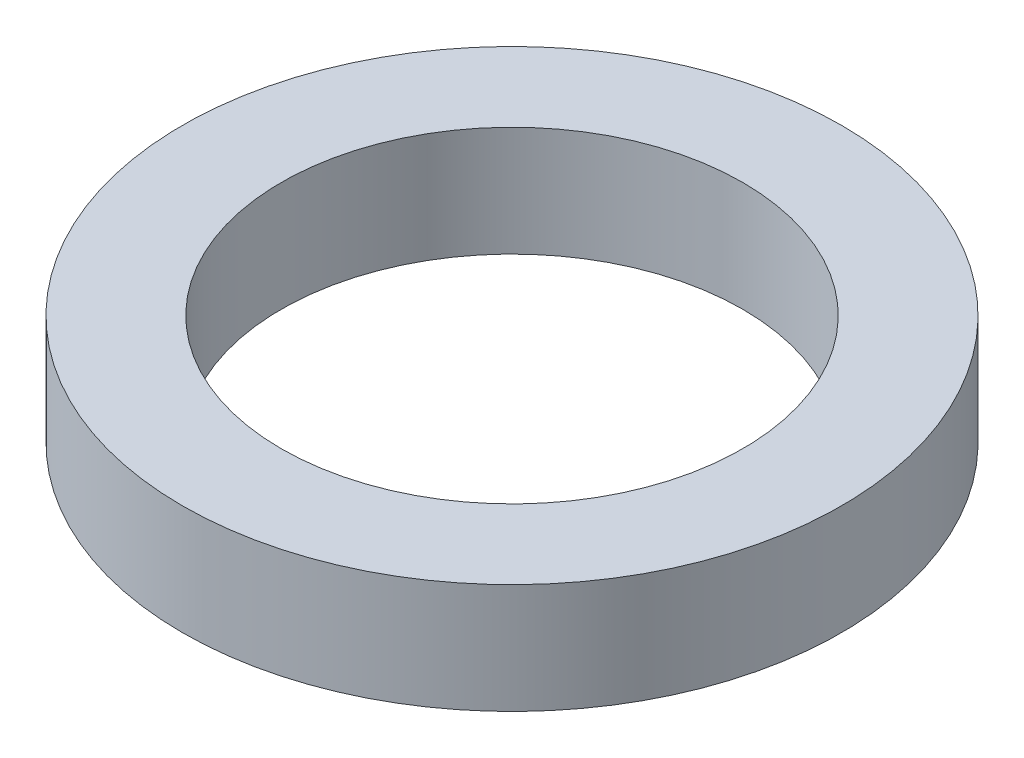
ISO-10303-21;
HEADER;
FILE_DESCRIPTION(('STEP AP214'),'2;1');
FILE_NAME('part.step','',(''),(''),'','','');
FILE_SCHEMA(('AUTOMOTIVE_DESIGN { 1 0 10303 214 1 1 1 1 }'));
ENDSEC;
DATA;
#1=APPLICATION_CONTEXT('core data for automotive mechanical design processes');
#2=APPLICATION_PROTOCOL_DEFINITION('international standard','automotive_design',2000,#1);
#3=PRODUCT_CONTEXT('',#1,'mechanical');
#4=PRODUCT('Part','Part','',(#3));
#5=PRODUCT_RELATED_PRODUCT_CATEGORY('part','',(#4));
#6=PRODUCT_DEFINITION_FORMATION('','',#4);
#7=PRODUCT_DEFINITION_CONTEXT('part definition',#1,'design');
#8=PRODUCT_DEFINITION('design','',#6,#7);
#9=PRODUCT_DEFINITION_SHAPE('','',#8);
#10=(LENGTH_UNIT() NAMED_UNIT(*) SI_UNIT(.MILLI.,.METRE.));
#11=(NAMED_UNIT(*) PLANE_ANGLE_UNIT() SI_UNIT($,.RADIAN.));
#12=(NAMED_UNIT(*) SI_UNIT($,.STERADIAN.) SOLID_ANGLE_UNIT());
#13=UNCERTAINTY_MEASURE_WITH_UNIT(LENGTH_MEASURE(1.E-05),#10,'distance_accuracy_value','');
#14=(GEOMETRIC_REPRESENTATION_CONTEXT(3) GLOBAL_UNCERTAINTY_ASSIGNED_CONTEXT((#13)) GLOBAL_UNIT_ASSIGNED_CONTEXT((#10,
#11,#12)) REPRESENTATION_CONTEXT('',''));
#15=CARTESIAN_POINT('',(0.,0.,0.));
#16=DIRECTION('',(0.,0.,1.));
#17=DIRECTION('',(1.,0.,0.));
#18=AXIS2_PLACEMENT_3D('',#15,#16,#17);
#19=CARTESIAN_POINT('',(0.,1.,0.));
#20=DIRECTION('',(0.,1.,0.));
#21=DIRECTION('',(0.,0.,1.));
#22=AXIS2_PLACEMENT_3D('',#19,#20,#21);
#23=PLANE('',#22);
#24=CARTESIAN_POINT('',(0.,1.,0.));
#25=DIRECTION('',(0.,1.,0.));
#26=DIRECTION('',(0.,0.,1.));
#27=AXIS2_PLACEMENT_3D('',#24,#25,#26);
#28=CIRCLE('',#27,3.);
#29=CARTESIAN_POINT('',(0.,1.,3.));
#30=VERTEX_POINT('',#29);
#31=EDGE_CURVE('E10',#30,#30,#28,.T.);
#32=ORIENTED_EDGE('',*,*,#31,.T.);
#33=EDGE_LOOP('',(#32));
#34=FACE_BOUND('',#33,.T.);
#35=CARTESIAN_POINT('',(0.,1.,0.));
#36=DIRECTION('',(0.,1.,0.));
#37=DIRECTION('',(0.,0.,1.));
#38=AXIS2_PLACEMENT_3D('',#35,#36,#37);
#39=CIRCLE('',#38,2.1);
#40=CARTESIAN_POINT('',(0.,1.,2.1));
#41=VERTEX_POINT('',#40);
#42=EDGE_CURVE('E44',#41,#41,#39,.T.);
#43=ORIENTED_EDGE('',*,*,#42,.F.);
#44=EDGE_LOOP('',(#43));
#45=FACE_BOUND('',#44,.T.);
#46=ADVANCED_FACE('F33',(#34,#45),#23,.T.);
#47=CARTESIAN_POINT('',(0.,0.,0.));
#48=DIRECTION('',(0.,1.,0.));
#49=DIRECTION('',(0.,0.,1.));
#50=AXIS2_PLACEMENT_3D('',#47,#48,#49);
#51=PLANE('',#50);
#52=CARTESIAN_POINT('',(0.,0.,0.));
#53=DIRECTION('',(0.,1.,0.));
#54=DIRECTION('',(0.,0.,1.));
#55=AXIS2_PLACEMENT_3D('',#52,#53,#54);
#56=CIRCLE('',#55,3.);
#57=CARTESIAN_POINT('',(0.,0.,3.));
#58=VERTEX_POINT('',#57);
#59=EDGE_CURVE('E37',#58,#58,#56,.T.);
#60=ORIENTED_EDGE('',*,*,#59,.F.);
#61=EDGE_LOOP('',(#60));
#62=FACE_BOUND('',#61,.T.);
#63=CARTESIAN_POINT('',(0.,0.,0.));
#64=DIRECTION('',(0.,1.,0.));
#65=DIRECTION('',(0.,0.,1.));
#66=AXIS2_PLACEMENT_3D('',#63,#64,#65);
#67=CIRCLE('',#66,2.1);
#68=CARTESIAN_POINT('',(0.,0.,2.1));
#69=VERTEX_POINT('',#68);
#70=EDGE_CURVE('E46',#69,#69,#67,.T.);
#71=ORIENTED_EDGE('',*,*,#70,.T.);
#72=EDGE_LOOP('',(#71));
#73=FACE_BOUND('',#72,.T.);
#74=ADVANCED_FACE('F56',(#62,#73),#51,.F.);
#75=CARTESIAN_POINT('',(0.,1.,0.));
#76=DIRECTION('',(0.,-1.,0.));
#77=DIRECTION('',(0.,0.,-1.));
#78=AXIS2_PLACEMENT_3D('',#75,#76,#77);
#79=CYLINDRICAL_SURFACE('',#78,3.);
#80=ORIENTED_EDGE('',*,*,#31,.F.);
#81=EDGE_LOOP('',(#80));
#82=FACE_BOUND('',#81,.T.);
#83=ORIENTED_EDGE('',*,*,#59,.T.);
#84=EDGE_LOOP('',(#83));
#85=FACE_BOUND('',#84,.T.);
#86=ADVANCED_FACE('F35',(#82,#85),#79,.T.);
#87=CARTESIAN_POINT('',(0.,1.,0.));
#88=DIRECTION('',(0.,-1.,0.));
#89=DIRECTION('',(0.,0.,-1.));
#90=AXIS2_PLACEMENT_3D('',#87,#88,#89);
#91=CYLINDRICAL_SURFACE('',#90,2.1);
#92=ORIENTED_EDGE('',*,*,#42,.T.);
#93=EDGE_LOOP('',(#92));
#94=FACE_BOUND('',#93,.T.);
#95=ORIENTED_EDGE('',*,*,#70,.F.);
#96=EDGE_LOOP('',(#95));
#97=FACE_BOUND('',#96,.T.);
#98=ADVANCED_FACE('F52',(#94,#97),#91,.F.);
#99=CLOSED_SHELL('',(#46,#74,#86,#98));
#100=MANIFOLD_SOLID_BREP('B2',#99);
#101=ADVANCED_BREP_SHAPE_REPRESENTATION('',(#18,#100),#14);
#102=SHAPE_DEFINITION_REPRESENTATION(#9,#101);
ENDSEC;
END-ISO-10303-21;
